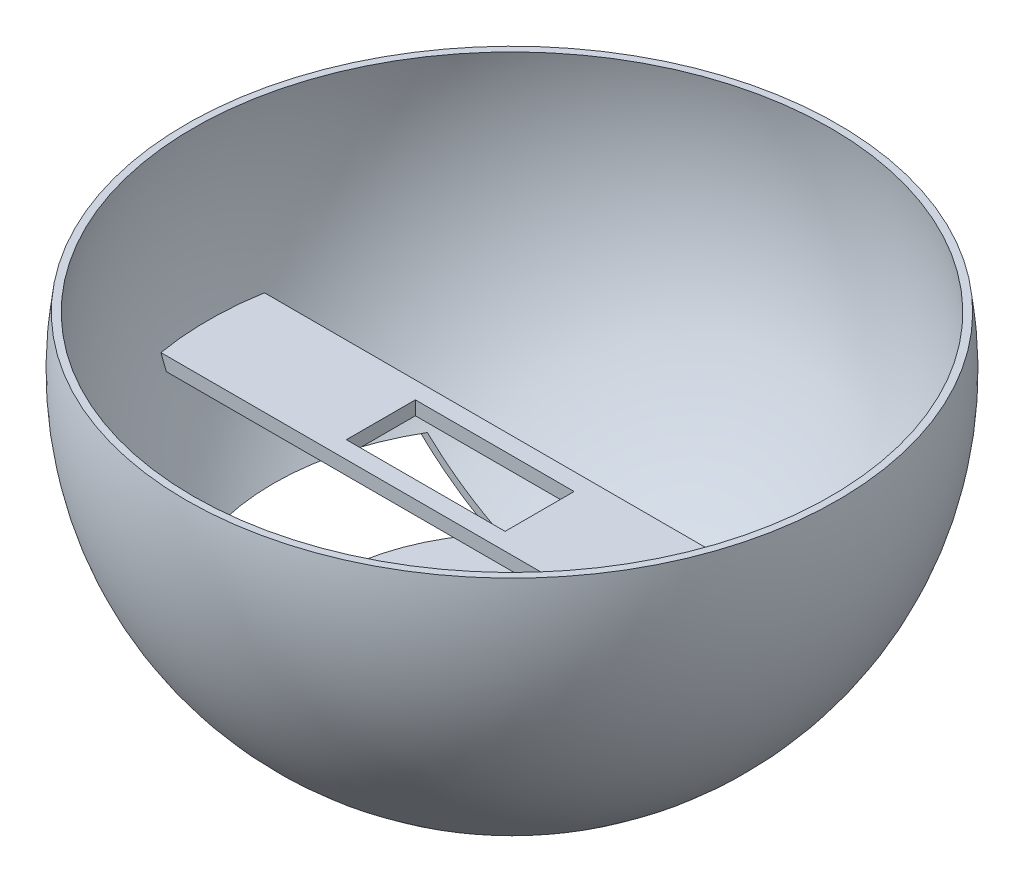
ISO-10303-21;
HEADER;
FILE_DESCRIPTION(('STEP AP214'),'2;1');
FILE_NAME('part.step','',(''),(''),'','','');
FILE_SCHEMA(('AUTOMOTIVE_DESIGN { 1 0 10303 214 1 1 1 1 }'));
ENDSEC;
DATA;
#1=APPLICATION_CONTEXT('core data for automotive mechanical design processes');
#2=APPLICATION_PROTOCOL_DEFINITION('international standard','automotive_design',2000,#1);
#3=PRODUCT_CONTEXT('',#1,'mechanical');
#4=PRODUCT('Part','Part','',(#3));
#5=PRODUCT_RELATED_PRODUCT_CATEGORY('part','',(#4));
#6=PRODUCT_DEFINITION_FORMATION('','',#4);
#7=PRODUCT_DEFINITION_CONTEXT('part definition',#1,'design');
#8=PRODUCT_DEFINITION('design','',#6,#7);
#9=PRODUCT_DEFINITION_SHAPE('','',#8);
#10=(LENGTH_UNIT() NAMED_UNIT(*) SI_UNIT(.MILLI.,.METRE.));
#11=(NAMED_UNIT(*) PLANE_ANGLE_UNIT() SI_UNIT($,.RADIAN.));
#12=(NAMED_UNIT(*) SI_UNIT($,.STERADIAN.) SOLID_ANGLE_UNIT());
#13=UNCERTAINTY_MEASURE_WITH_UNIT(LENGTH_MEASURE(1.E-05),#10,'distance_accuracy_value','');
#14=(GEOMETRIC_REPRESENTATION_CONTEXT(3) GLOBAL_UNCERTAINTY_ASSIGNED_CONTEXT((#13)) GLOBAL_UNIT_ASSIGNED_CONTEXT((#10,
#11,#12)) REPRESENTATION_CONTEXT('',''));
#15=CARTESIAN_POINT('',(0.,0.,0.));
#16=DIRECTION('',(0.,0.,1.));
#17=DIRECTION('',(1.,0.,0.));
#18=AXIS2_PLACEMENT_3D('',#15,#16,#17);
#19=CARTESIAN_POINT('',(0.,0.,0.));
#20=DIRECTION('',(0.,1.,0.));
#21=DIRECTION('',(0.,0.,1.));
#22=AXIS2_PLACEMENT_3D('',#19,#20,#21);
#23=SPHERICAL_SURFACE('',#22,46.75);
#24=CARTESIAN_POINT('',(0.,0.,7.5));
#25=DIRECTION('',(0.,0.,1.));
#26=DIRECTION('',(1.,0.,0.));
#27=AXIS2_PLACEMENT_3D('',#24,#25,#26);
#28=CIRCLE('',#27,46.1444742087284);
#29=CARTESIAN_POINT('',(-43.3630852789267,-15.778318512837,7.5));
#30=VERTEX_POINT('',#29);
#31=CARTESIAN_POINT('',(-42.5822015736166,-17.778318512837,7.5));
#32=VERTEX_POINT('',#31);
#33=EDGE_CURVE('E181',#30,#32,#28,.T.);
#34=ORIENTED_EDGE('',*,*,#33,.F.);
#35=CARTESIAN_POINT('',(0.,-15.778318512837,0.));
#36=DIRECTION('',(0.,1.,0.));
#37=DIRECTION('',(0.,0.,1.));
#38=AXIS2_PLACEMENT_3D('',#35,#36,#37);
#39=CIRCLE('',#38,44.0068990603458);
#40=CARTESIAN_POINT('',(-43.3630852789267,-15.778318512837,-7.49999999999999));
#41=VERTEX_POINT('',#40);
#42=EDGE_CURVE('E190',#41,#30,#39,.T.);
#43=ORIENTED_EDGE('',*,*,#42,.F.);
#44=CARTESIAN_POINT('',(0.,0.,-7.5));
#45=DIRECTION('',(0.,0.,-1.));
#46=DIRECTION('',(-1.,0.,0.));
#47=AXIS2_PLACEMENT_3D('',#44,#45,#46);
#48=CIRCLE('',#47,46.1444742087284);
#49=CARTESIAN_POINT('',(-42.5822015736166,-17.778318512837,-7.5));
#50=VERTEX_POINT('',#49);
#51=EDGE_CURVE('E187',#50,#41,#48,.T.);
#52=ORIENTED_EDGE('',*,*,#51,.F.);
#53=CARTESIAN_POINT('',(0.,-17.778318512837,0.));
#54=DIRECTION('',(0.,-1.,0.));
#55=DIRECTION('',(0.,0.,-1.));
#56=AXIS2_PLACEMENT_3D('',#53,#54,#55);
#57=CIRCLE('',#56,43.2376443721917);
#58=EDGE_CURVE('E184',#32,#50,#57,.T.);
#59=ORIENTED_EDGE('',*,*,#58,.F.);
#60=EDGE_LOOP('',(#34,#43,#52,#59));
#61=FACE_BOUND('',#60,.T.);
#62=CARTESIAN_POINT('',(0.,7.22168148716304,0.));
#63=DIRECTION('',(0.,1.,0.));
#64=DIRECTION('',(0.,0.,1.));
#65=AXIS2_PLACEMENT_3D('',#62,#63,#64);
#66=CIRCLE('',#65,46.1888494822935);
#67=CARTESIAN_POINT('',(0.,7.22168148716304,46.1888494822935));
#68=VERTEX_POINT('',#67);
#69=EDGE_CURVE('E210',#68,#68,#66,.T.);
#70=ORIENTED_EDGE('',*,*,#69,.T.);
#71=EDGE_LOOP('',(#70));
#72=FACE_BOUND('',#71,.T.);
#73=CARTESIAN_POINT('',(0.,-31.5137104735083,0.));
#74=DIRECTION('',(0.,1.,0.));
#75=DIRECTION('',(0.,0.,1.));
#76=AXIS2_PLACEMENT_3D('',#73,#74,#75);
#77=CIRCLE('',#76,34.5318483749696);
#78=CARTESIAN_POINT('',(-29.7690871911097,-31.5137104735083,17.5));
#79=VERTEX_POINT('',#78);
#80=CARTESIAN_POINT('',(-29.7690871911097,-31.5137104735083,-17.5));
#81=VERTEX_POINT('',#80);
#82=EDGE_CURVE('E120',#79,#81,#77,.F.);
#83=ORIENTED_EDGE('',*,*,#82,.T.);
#84=CARTESIAN_POINT('',(0.,0.,-17.5));
#85=DIRECTION('',(0.,0.,-1.));
#86=DIRECTION('',(-1.,0.,0.));
#87=AXIS2_PLACEMENT_3D('',#84,#85,#86);
#88=CIRCLE('',#87,43.3510380498553);
#89=CARTESIAN_POINT('',(-17.8319708561831,-39.5137104735083,-17.5));
#90=VERTEX_POINT('',#89);
#91=EDGE_CURVE('E126',#81,#90,#88,.F.);
#92=ORIENTED_EDGE('',*,*,#91,.T.);
#93=CARTESIAN_POINT('',(0.,-39.5137104735083,0.));
#94=DIRECTION('',(0.,-1.,0.));
#95=DIRECTION('',(0.,0.,-1.));
#96=AXIS2_PLACEMENT_3D('',#93,#94,#95);
#97=CIRCLE('',#96,24.984578936131);
#98=CARTESIAN_POINT('',(-17.8319708561831,-39.5137104735083,17.5));
#99=VERTEX_POINT('',#98);
#100=EDGE_CURVE('E141',#99,#90,#97,.F.);
#101=ORIENTED_EDGE('',*,*,#100,.F.);
#102=CARTESIAN_POINT('',(0.,0.,17.5));
#103=DIRECTION('',(0.,0.,1.));
#104=DIRECTION('',(0.,-1.,0.));
#105=AXIS2_PLACEMENT_3D('',#102,#103,#104);
#106=CIRCLE('',#105,43.3510380498553);
#107=EDGE_CURVE('E131',#99,#79,#106,.F.);
#108=ORIENTED_EDGE('',*,*,#107,.T.);
#109=EDGE_LOOP('',(#83,#92,#101,#108));
#110=FACE_BOUND('',#109,.T.);
#111=CARTESIAN_POINT('',(0.,-17.778318512837,0.));
#112=DIRECTION('',(0.,1.,0.));
#113=DIRECTION('',(0.,0.,1.));
#114=AXIS2_PLACEMENT_3D('',#111,#112,#113);
#115=CIRCLE('',#114,43.2376443721917);
#116=CARTESIAN_POINT('',(42.5822015736166,-17.778318512837,7.5));
#117=VERTEX_POINT('',#116);
#118=CARTESIAN_POINT('',(42.5822015736166,-17.778318512837,-7.5));
#119=VERTEX_POINT('',#118);
#120=EDGE_CURVE('E206',#117,#119,#115,.T.);
#121=ORIENTED_EDGE('',*,*,#120,.T.);
#122=CARTESIAN_POINT('',(0.,0.,-7.49999999999991));
#123=DIRECTION('',(0.,0.,1.));
#124=DIRECTION('',(0.,-1.,0.));
#125=AXIS2_PLACEMENT_3D('',#122,#123,#124);
#126=CIRCLE('',#125,46.1444742087284);
#127=CARTESIAN_POINT('',(43.3630852789267,-15.778318512837,-7.49999999999999));
#128=VERTEX_POINT('',#127);
#129=EDGE_CURVE('E204',#119,#128,#126,.T.);
#130=ORIENTED_EDGE('',*,*,#129,.T.);
#131=CARTESIAN_POINT('',(0.,-15.778318512837,0.));
#132=DIRECTION('',(0.,-1.,0.));
#133=DIRECTION('',(0.,0.,-1.));
#134=AXIS2_PLACEMENT_3D('',#131,#132,#133);
#135=CIRCLE('',#134,44.0068990603458);
#136=CARTESIAN_POINT('',(43.3630852789267,-15.778318512837,7.5));
#137=VERTEX_POINT('',#136);
#138=EDGE_CURVE('E202',#128,#137,#135,.T.);
#139=ORIENTED_EDGE('',*,*,#138,.T.);
#140=CARTESIAN_POINT('',(0.,0.,7.5));
#141=DIRECTION('',(0.,0.,-1.));
#142=DIRECTION('',(-1.,0.,0.));
#143=AXIS2_PLACEMENT_3D('',#140,#141,#142);
#144=CIRCLE('',#143,46.1444742087284);
#145=EDGE_CURVE('E196',#137,#117,#144,.T.);
#146=ORIENTED_EDGE('',*,*,#145,.T.);
#147=EDGE_LOOP('',(#121,#130,#139,#146));
#148=FACE_BOUND('',#147,.T.);
#149=ADVANCED_FACE('F35',(#61,#72,#110,#148),#23,.F.);
#150=CARTESIAN_POINT('',(0.,7.22168148716304,47.2007395757521));
#151=DIRECTION('',(0.,1.,0.));
#152=DIRECTION('',(0.,0.,1.));
#153=AXIS2_PLACEMENT_3D('',#150,#151,#152);
#154=PLANE('',#153);
#155=ORIENTED_EDGE('',*,*,#69,.F.);
#156=EDGE_LOOP('',(#155));
#157=FACE_BOUND('',#156,.T.);
#158=CARTESIAN_POINT('',(0.,7.22168148716304,0.));
#159=DIRECTION('',(0.,1.,0.));
#160=DIRECTION('',(0.,0.,1.));
#161=AXIS2_PLACEMENT_3D('',#158,#159,#160);
#162=CIRCLE('',#161,47.200739575752);
#163=CARTESIAN_POINT('',(0.,7.22168148716304,47.2007395757521));
#164=VERTEX_POINT('',#163);
#165=EDGE_CURVE('E216',#164,#164,#162,.T.);
#166=ORIENTED_EDGE('',*,*,#165,.T.);
#167=EDGE_LOOP('',(#166));
#168=FACE_BOUND('',#167,.T.);
#169=ADVANCED_FACE('F37',(#157,#168),#154,.T.);
#170=CARTESIAN_POINT('',(0.,0.,0.));
#171=DIRECTION('',(0.,1.,0.));
#172=DIRECTION('',(0.,0.,1.));
#173=AXIS2_PLACEMENT_3D('',#170,#171,#172);
#174=SPHERICAL_SURFACE('',#173,47.75);
#175=CARTESIAN_POINT('',(0.,0.,-17.5));
#176=DIRECTION('',(0.,0.,-1.));
#177=DIRECTION('',(-1.,0.,0.));
#178=AXIS2_PLACEMENT_3D('',#175,#176,#177);
#179=CIRCLE('',#178,44.4276096588597);
#180=CARTESIAN_POINT('',(-31.316106913087,-31.5137104735083,-17.5));
#181=VERTEX_POINT('',#180);
#182=CARTESIAN_POINT('',(-20.3095835657889,-39.5137104735083,-17.5));
#183=VERTEX_POINT('',#182);
#184=EDGE_CURVE('E142',#181,#183,#179,.F.);
#185=ORIENTED_EDGE('',*,*,#184,.F.);
#186=CARTESIAN_POINT('',(0.,-31.5137104735083,0.));
#187=DIRECTION('',(0.,1.,0.));
#188=DIRECTION('',(0.,0.,1.));
#189=AXIS2_PLACEMENT_3D('',#186,#187,#188);
#190=CIRCLE('',#189,35.8740651751637);
#191=CARTESIAN_POINT('',(-31.316106913087,-31.5137104735083,17.5));
#192=VERTEX_POINT('',#191);
#193=EDGE_CURVE('E43',#192,#181,#190,.F.);
#194=ORIENTED_EDGE('',*,*,#193,.F.);
#195=CARTESIAN_POINT('',(0.,0.,17.5));
#196=DIRECTION('',(0.,0.,1.));
#197=DIRECTION('',(0.,-1.,0.));
#198=AXIS2_PLACEMENT_3D('',#195,#196,#197);
#199=CIRCLE('',#198,44.4276096588597);
#200=CARTESIAN_POINT('',(-20.3095835657889,-39.5137104735083,17.5));
#201=VERTEX_POINT('',#200);
#202=EDGE_CURVE('E134',#201,#192,#199,.F.);
#203=ORIENTED_EDGE('',*,*,#202,.F.);
#204=CARTESIAN_POINT('',(0.,-39.5137104735083,0.));
#205=DIRECTION('',(0.,-1.,0.));
#206=DIRECTION('',(0.,0.,-1.));
#207=AXIS2_PLACEMENT_3D('',#204,#205,#206);
#208=CIRCLE('',#207,26.8091250251805);
#209=EDGE_CURVE('E11',#183,#201,#208,.F.);
#210=ORIENTED_EDGE('',*,*,#209,.F.);
#211=EDGE_LOOP('',(#185,#194,#203,#210));
#212=FACE_BOUND('',#211,.T.);
#213=CARTESIAN_POINT('',(0.,-40.5137104735083,0.));
#214=DIRECTION('',(0.,1.,0.));
#215=DIRECTION('',(0.,0.,1.));
#216=AXIS2_PLACEMENT_3D('',#213,#214,#215);
#217=CIRCLE('',#216,25.2725496076028);
#218=CARTESIAN_POINT('',(0.,-40.5137104735083,25.2725496076028));
#219=VERTEX_POINT('',#218);
#220=EDGE_CURVE('E213',#219,#219,#217,.T.);
#221=ORIENTED_EDGE('',*,*,#220,.T.);
#222=EDGE_LOOP('',(#221));
#223=FACE_BOUND('',#222,.T.);
#224=ORIENTED_EDGE('',*,*,#165,.F.);
#225=EDGE_LOOP('',(#224));
#226=FACE_BOUND('',#225,.T.);
#227=ADVANCED_FACE('F224',(#212,#223,#226),#174,.T.);
#228=CARTESIAN_POINT('',(0.,-40.5137104735083,0.));
#229=DIRECTION('',(0.,-1.,0.));
#230=DIRECTION('',(0.,0.,-1.));
#231=AXIS2_PLACEMENT_3D('',#228,#229,#230);
#232=PLANE('',#231);
#233=ORIENTED_EDGE('',*,*,#220,.F.);
#234=EDGE_LOOP('',(#233));
#235=FACE_BOUND('',#234,.T.);
#236=ADVANCED_FACE('F232',(#235),#232,.T.);
#237=CARTESIAN_POINT('',(0.,-39.5137104735083,0.));
#238=DIRECTION('',(0.,-1.,0.));
#239=DIRECTION('',(0.,0.,-1.));
#240=AXIS2_PLACEMENT_3D('',#237,#238,#239);
#241=PLANE('',#240);
#242=ORIENTED_EDGE('',*,*,#100,.T.);
#243=DIRECTION('',(1.,0.,0.));
#244=VECTOR('',#243,1.);
#245=CARTESIAN_POINT('',(-47.,-39.5137104735083,-17.5));
#246=LINE('',#245,#244);
#247=EDGE_CURVE('E145',#183,#90,#246,.T.);
#248=ORIENTED_EDGE('',*,*,#247,.F.);
#249=ORIENTED_EDGE('',*,*,#209,.T.);
#250=DIRECTION('',(1.,0.,0.));
#251=VECTOR('',#250,1.);
#252=CARTESIAN_POINT('',(-47.,-39.5137104735083,17.5));
#253=LINE('',#252,#251);
#254=EDGE_CURVE('E136',#201,#99,#253,.T.);
#255=ORIENTED_EDGE('',*,*,#254,.T.);
#256=EDGE_LOOP('',(#242,#248,#249,#255));
#257=FACE_BOUND('',#256,.T.);
#258=ADVANCED_FACE('F227',(#257),#241,.F.);
#259=CARTESIAN_POINT('',(500000.,-17.778318512837,7.50000000000001));
#260=DIRECTION('',(0.,1.,0.));
#261=DIRECTION('',(0.,0.,1.));
#262=AXIS2_PLACEMENT_3D('',#259,#260,#261);
#263=PLANE('',#262);
#264=DIRECTION('',(1.,0.,0.));
#265=VECTOR('',#264,1.);
#266=CARTESIAN_POINT('',(500000.,-17.778318512837,4.99999999994343));
#267=LINE('',#266,#265);
#268=CARTESIAN_POINT('',(-19.,-17.778318512837,5.));
#269=VERTEX_POINT('',#268);
#270=CARTESIAN_POINT('',(4.,-17.778318512837,5.));
#271=VERTEX_POINT('',#270);
#272=EDGE_CURVE('E175',#269,#271,#267,.T.);
#273=ORIENTED_EDGE('',*,*,#272,.T.);
#274=DIRECTION('',(0.,0.,-1.));
#275=VECTOR('',#274,1.);
#276=CARTESIAN_POINT('',(4.0000000000191,-17.778318512837,7.50000000000001));
#277=LINE('',#276,#275);
#278=CARTESIAN_POINT('',(4.,-17.778318512837,-5.));
#279=VERTEX_POINT('',#278);
#280=EDGE_CURVE('E178',#271,#279,#277,.T.);
#281=ORIENTED_EDGE('',*,*,#280,.T.);
#282=DIRECTION('',(-1.,0.,0.));
#283=VECTOR('',#282,1.);
#284=CARTESIAN_POINT('',(500000.,-17.778318512837,-5.00000000005657));
#285=LINE('',#284,#283);
#286=CARTESIAN_POINT('',(-19.0000000000055,-17.778318512837,-5.));
#287=VERTEX_POINT('',#286);
#288=EDGE_CURVE('E163',#279,#287,#285,.T.);
#289=ORIENTED_EDGE('',*,*,#288,.T.);
#290=DIRECTION('',(0.,0.,1.));
#291=VECTOR('',#290,1.);
#292=CARTESIAN_POINT('',(-19.0000000000055,-17.778318512837,7.50000000000001));
#293=LINE('',#292,#291);
#294=EDGE_CURVE('E172',#287,#269,#293,.T.);
#295=ORIENTED_EDGE('',*,*,#294,.T.);
#296=EDGE_LOOP('',(#273,#281,#289,#295));
#297=FACE_BOUND('',#296,.T.);
#298=ORIENTED_EDGE('',*,*,#120,.F.);
#299=DIRECTION('',(-1.,0.,0.));
#300=VECTOR('',#299,1.);
#301=CARTESIAN_POINT('',(500000.,-17.778318512837,7.50000000000001));
#302=LINE('',#301,#300);
#303=EDGE_CURVE('E194',#117,#32,#302,.T.);
#304=ORIENTED_EDGE('',*,*,#303,.T.);
#305=ORIENTED_EDGE('',*,*,#58,.T.);
#306=DIRECTION('',(-1.,0.,0.));
#307=VECTOR('',#306,1.);
#308=CARTESIAN_POINT('',(500000.,-17.778318512837,-7.50000000000001));
#309=LINE('',#308,#307);
#310=EDGE_CURVE('E197',#119,#50,#309,.T.);
#311=ORIENTED_EDGE('',*,*,#310,.F.);
#312=EDGE_LOOP('',(#298,#304,#305,#311));
#313=FACE_BOUND('',#312,.T.);
#314=ADVANCED_FACE('F231',(#297,#313),#263,.F.);
#315=CARTESIAN_POINT('',(500000.,-15.778318512837,7.50000000000001));
#316=DIRECTION('',(0.,0.,-1.));
#317=DIRECTION('',(-1.,0.,0.));
#318=AXIS2_PLACEMENT_3D('',#315,#316,#317);
#319=PLANE('',#318);
#320=ORIENTED_EDGE('',*,*,#145,.F.);
#321=DIRECTION('',(-1.,0.,0.));
#322=VECTOR('',#321,1.);
#323=CARTESIAN_POINT('',(500000.,-15.778318512837,7.50000000000001));
#324=LINE('',#323,#322);
#325=EDGE_CURVE('E193',#137,#30,#324,.T.);
#326=ORIENTED_EDGE('',*,*,#325,.T.);
#327=ORIENTED_EDGE('',*,*,#33,.T.);
#328=ORIENTED_EDGE('',*,*,#303,.F.);
#329=EDGE_LOOP('',(#320,#326,#327,#328));
#330=FACE_BOUND('',#329,.T.);
#331=ADVANCED_FACE('F239',(#330),#319,.F.);
#332=CARTESIAN_POINT('',(500000.,-15.778318512837,-7.49999999999999));
#333=DIRECTION('',(0.,0.,1.));
#334=DIRECTION('',(0.,-1.,0.));
#335=AXIS2_PLACEMENT_3D('',#332,#333,#334);
#336=PLANE('',#335);
#337=ORIENTED_EDGE('',*,*,#129,.F.);
#338=ORIENTED_EDGE('',*,*,#310,.T.);
#339=ORIENTED_EDGE('',*,*,#51,.T.);
#340=DIRECTION('',(-1.,0.,0.));
#341=VECTOR('',#340,1.);
#342=CARTESIAN_POINT('',(500000.,-15.778318512837,-7.49999999999999));
#343=LINE('',#342,#341);
#344=EDGE_CURVE('E199',#128,#41,#343,.T.);
#345=ORIENTED_EDGE('',*,*,#344,.F.);
#346=EDGE_LOOP('',(#337,#338,#339,#345));
#347=FACE_BOUND('',#346,.T.);
#348=ADVANCED_FACE('F247',(#347),#336,.F.);
#349=CARTESIAN_POINT('',(500000.,-15.778318512837,7.50000000000001));
#350=DIRECTION('',(0.,-1.,0.));
#351=DIRECTION('',(0.,0.,-1.));
#352=AXIS2_PLACEMENT_3D('',#349,#350,#351);
#353=PLANE('',#352);
#354=DIRECTION('',(-1.,0.,0.));
#355=VECTOR('',#354,1.);
#356=CARTESIAN_POINT('',(4.,-15.778318512837,-5.));
#357=LINE('',#356,#355);
#358=CARTESIAN_POINT('',(4.0000000000191,-15.778318512837,-5.));
#359=VERTEX_POINT('',#358);
#360=CARTESIAN_POINT('',(-19.,-15.778318512837,-5.));
#361=VERTEX_POINT('',#360);
#362=EDGE_CURVE('E151',#359,#361,#357,.T.);
#363=ORIENTED_EDGE('',*,*,#362,.F.);
#364=DIRECTION('',(0.,0.,-1.));
#365=VECTOR('',#364,1.);
#366=CARTESIAN_POINT('',(4.,-15.778318512837,5.));
#367=LINE('',#366,#365);
#368=CARTESIAN_POINT('',(4.,-15.778318512837,5.));
#369=VERTEX_POINT('',#368);
#370=EDGE_CURVE('E125',#369,#359,#367,.T.);
#371=ORIENTED_EDGE('',*,*,#370,.F.);
#372=DIRECTION('',(1.,0.,0.));
#373=VECTOR('',#372,1.);
#374=CARTESIAN_POINT('',(4.,-15.778318512837,5.));
#375=LINE('',#374,#373);
#376=CARTESIAN_POINT('',(-19.,-15.778318512837,5.));
#377=VERTEX_POINT('',#376);
#378=EDGE_CURVE('E157',#377,#369,#375,.T.);
#379=ORIENTED_EDGE('',*,*,#378,.F.);
#380=DIRECTION('',(0.,0.,1.));
#381=VECTOR('',#380,1.);
#382=CARTESIAN_POINT('',(-19.,-15.778318512837,5.));
#383=LINE('',#382,#381);
#384=EDGE_CURVE('E154',#361,#377,#383,.T.);
#385=ORIENTED_EDGE('',*,*,#384,.F.);
#386=EDGE_LOOP('',(#363,#371,#379,#385));
#387=FACE_BOUND('',#386,.T.);
#388=ORIENTED_EDGE('',*,*,#138,.F.);
#389=ORIENTED_EDGE('',*,*,#344,.T.);
#390=ORIENTED_EDGE('',*,*,#42,.T.);
#391=ORIENTED_EDGE('',*,*,#325,.F.);
#392=EDGE_LOOP('',(#388,#389,#390,#391));
#393=FACE_BOUND('',#392,.T.);
#394=ADVANCED_FACE('F234',(#387,#393),#353,.F.);
#395=CARTESIAN_POINT('',(4.,-25.778318512837,5.));
#396=DIRECTION('',(1.,0.,0.));
#397=DIRECTION('',(0.,0.,-1.));
#398=AXIS2_PLACEMENT_3D('',#395,#396,#397);
#399=PLANE('',#398);
#400=DIRECTION('',(0.,1.,0.));
#401=VECTOR('',#400,1.);
#402=CARTESIAN_POINT('',(4.,-25.778318512837,5.));
#403=LINE('',#402,#401);
#404=EDGE_CURVE('E161',#271,#369,#403,.T.);
#405=ORIENTED_EDGE('',*,*,#404,.T.);
#406=ORIENTED_EDGE('',*,*,#370,.T.);
#407=DIRECTION('',(0.,1.,0.));
#408=VECTOR('',#407,1.);
#409=CARTESIAN_POINT('',(4.,-25.778318512837,-5.));
#410=LINE('',#409,#408);
#411=EDGE_CURVE('E160',#279,#359,#410,.T.);
#412=ORIENTED_EDGE('',*,*,#411,.F.);
#413=ORIENTED_EDGE('',*,*,#280,.F.);
#414=EDGE_LOOP('',(#405,#406,#412,#413));
#415=FACE_BOUND('',#414,.T.);
#416=ADVANCED_FACE('F242',(#415),#399,.F.);
#417=CARTESIAN_POINT('',(4.,-25.778318512837,5.));
#418=DIRECTION('',(0.,0.,1.));
#419=DIRECTION('',(0.,-1.,0.));
#420=AXIS2_PLACEMENT_3D('',#417,#418,#419);
#421=PLANE('',#420);
#422=DIRECTION('',(0.,1.,0.));
#423=VECTOR('',#422,1.);
#424=CARTESIAN_POINT('',(-19.,-25.778318512837,5.));
#425=LINE('',#424,#423);
#426=EDGE_CURVE('E164',#269,#377,#425,.T.);
#427=ORIENTED_EDGE('',*,*,#426,.T.);
#428=ORIENTED_EDGE('',*,*,#378,.T.);
#429=ORIENTED_EDGE('',*,*,#404,.F.);
#430=ORIENTED_EDGE('',*,*,#272,.F.);
#431=EDGE_LOOP('',(#427,#428,#429,#430));
#432=FACE_BOUND('',#431,.T.);
#433=ADVANCED_FACE('F267',(#432),#421,.F.);
#434=CARTESIAN_POINT('',(-19.,-25.778318512837,5.));
#435=DIRECTION('',(-1.,0.,0.));
#436=DIRECTION('',(0.,0.,1.));
#437=AXIS2_PLACEMENT_3D('',#434,#435,#436);
#438=PLANE('',#437);
#439=DIRECTION('',(0.,1.,0.));
#440=VECTOR('',#439,1.);
#441=CARTESIAN_POINT('',(-19.,-25.778318512837,-5.));
#442=LINE('',#441,#440);
#443=EDGE_CURVE('E166',#287,#361,#442,.T.);
#444=ORIENTED_EDGE('',*,*,#443,.T.);
#445=ORIENTED_EDGE('',*,*,#384,.T.);
#446=ORIENTED_EDGE('',*,*,#426,.F.);
#447=ORIENTED_EDGE('',*,*,#294,.F.);
#448=EDGE_LOOP('',(#444,#445,#446,#447));
#449=FACE_BOUND('',#448,.T.);
#450=ADVANCED_FACE('F272',(#449),#438,.F.);
#451=CARTESIAN_POINT('',(4.,-25.778318512837,-5.));
#452=DIRECTION('',(0.,0.,-1.));
#453=DIRECTION('',(0.,1.,0.));
#454=AXIS2_PLACEMENT_3D('',#451,#452,#453);
#455=PLANE('',#454);
#456=ORIENTED_EDGE('',*,*,#411,.T.);
#457=ORIENTED_EDGE('',*,*,#362,.T.);
#458=ORIENTED_EDGE('',*,*,#443,.F.);
#459=ORIENTED_EDGE('',*,*,#288,.F.);
#460=EDGE_LOOP('',(#456,#457,#458,#459));
#461=FACE_BOUND('',#460,.T.);
#462=ADVANCED_FACE('F269',(#461),#455,.F.);
#463=CARTESIAN_POINT('',(-47.,-31.5137104735083,-17.5));
#464=DIRECTION('',(0.,1.,0.));
#465=DIRECTION('',(0.,0.,1.));
#466=AXIS2_PLACEMENT_3D('',#463,#464,#465);
#467=PLANE('',#466);
#468=DIRECTION('',(1.,0.,0.));
#469=VECTOR('',#468,1.);
#470=CARTESIAN_POINT('',(-47.,-31.5137104735083,17.5));
#471=LINE('',#470,#469);
#472=EDGE_CURVE('E55',#192,#79,#471,.T.);
#473=ORIENTED_EDGE('',*,*,#472,.F.);
#474=ORIENTED_EDGE('',*,*,#193,.T.);
#475=DIRECTION('',(1.,0.,0.));
#476=VECTOR('',#475,1.);
#477=CARTESIAN_POINT('',(-47.,-31.5137104735083,-17.5));
#478=LINE('',#477,#476);
#479=EDGE_CURVE('E50',#181,#81,#478,.T.);
#480=ORIENTED_EDGE('',*,*,#479,.T.);
#481=ORIENTED_EDGE('',*,*,#82,.F.);
#482=EDGE_LOOP('',(#473,#474,#480,#481));
#483=FACE_BOUND('',#482,.T.);
#484=ADVANCED_FACE('F121',(#483),#467,.F.);
#485=CARTESIAN_POINT('',(-47.,-31.5137104735083,-17.5));
#486=DIRECTION('',(0.,0.,-1.));
#487=DIRECTION('',(-1.,0.,0.));
#488=AXIS2_PLACEMENT_3D('',#485,#486,#487);
#489=PLANE('',#488);
#490=ORIENTED_EDGE('',*,*,#479,.F.);
#491=ORIENTED_EDGE('',*,*,#184,.T.);
#492=ORIENTED_EDGE('',*,*,#247,.T.);
#493=ORIENTED_EDGE('',*,*,#91,.F.);
#494=EDGE_LOOP('',(#490,#491,#492,#493));
#495=FACE_BOUND('',#494,.T.);
#496=ADVANCED_FACE('F221',(#495),#489,.F.);
#497=CARTESIAN_POINT('',(-47.,-31.5137104735083,17.5));
#498=DIRECTION('',(0.,0.,1.));
#499=DIRECTION('',(0.,-1.,0.));
#500=AXIS2_PLACEMENT_3D('',#497,#498,#499);
#501=PLANE('',#500);
#502=ORIENTED_EDGE('',*,*,#254,.F.);
#503=ORIENTED_EDGE('',*,*,#202,.T.);
#504=ORIENTED_EDGE('',*,*,#472,.T.);
#505=ORIENTED_EDGE('',*,*,#107,.F.);
#506=EDGE_LOOP('',(#502,#503,#504,#505));
#507=FACE_BOUND('',#506,.T.);
#508=ADVANCED_FACE('F130',(#507),#501,.F.);
#509=CLOSED_SHELL('',(#149,#169,#227,#236,#258,#314,#331,#348,#394,#416,#433,#450,#462,#484,
#496,#508));
#510=MANIFOLD_SOLID_BREP('B2',#509);
#511=ADVANCED_BREP_SHAPE_REPRESENTATION('',(#18,#510),#14);
#512=SHAPE_DEFINITION_REPRESENTATION(#9,#511);
ENDSEC;
END-ISO-10303-21;
